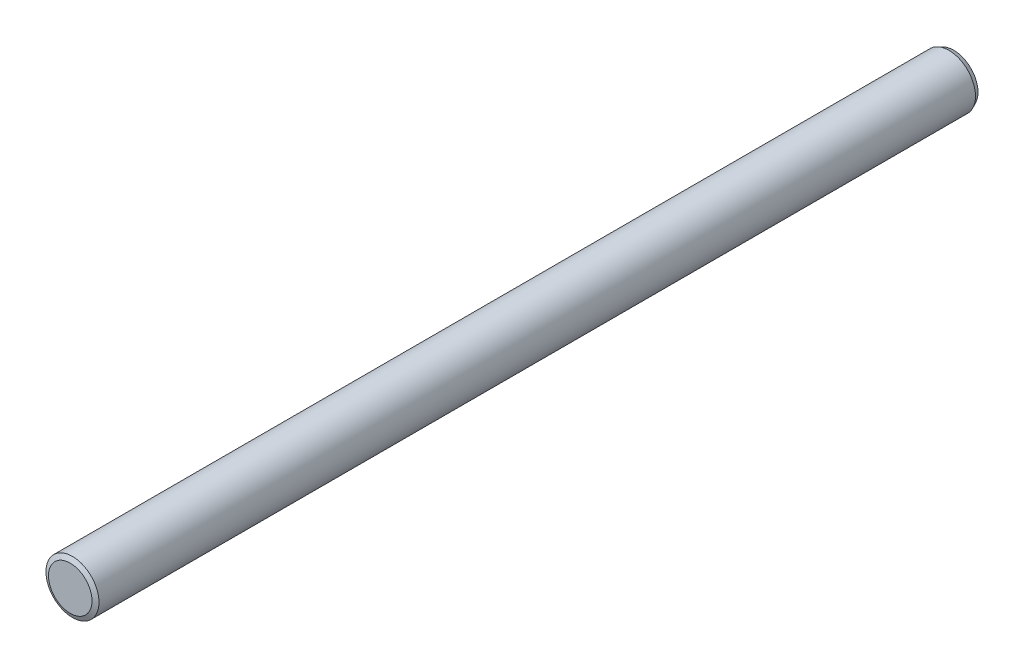
ISO-10303-21;
HEADER;
FILE_DESCRIPTION(('STEP AP214'),'2;1');
FILE_NAME('part.step','',(''),(''),'','','');
FILE_SCHEMA(('AUTOMOTIVE_DESIGN { 1 0 10303 214 1 1 1 1 }'));
ENDSEC;
DATA;
#1=APPLICATION_CONTEXT('core data for automotive mechanical design processes');
#2=APPLICATION_PROTOCOL_DEFINITION('international standard','automotive_design',2000,#1);
#3=PRODUCT_CONTEXT('',#1,'mechanical');
#4=PRODUCT('Part','Part','',(#3));
#5=PRODUCT_RELATED_PRODUCT_CATEGORY('part','',(#4));
#6=PRODUCT_DEFINITION_FORMATION('','',#4);
#7=PRODUCT_DEFINITION_CONTEXT('part definition',#1,'design');
#8=PRODUCT_DEFINITION('design','',#6,#7);
#9=PRODUCT_DEFINITION_SHAPE('','',#8);
#10=(LENGTH_UNIT() NAMED_UNIT(*) SI_UNIT(.MILLI.,.METRE.));
#11=(NAMED_UNIT(*) PLANE_ANGLE_UNIT() SI_UNIT($,.RADIAN.));
#12=(NAMED_UNIT(*) SI_UNIT($,.STERADIAN.) SOLID_ANGLE_UNIT());
#13=UNCERTAINTY_MEASURE_WITH_UNIT(LENGTH_MEASURE(1.E-05),#10,'distance_accuracy_value','');
#14=(GEOMETRIC_REPRESENTATION_CONTEXT(3) GLOBAL_UNCERTAINTY_ASSIGNED_CONTEXT((#13)) GLOBAL_UNIT_ASSIGNED_CONTEXT((#10,
#11,#12)) REPRESENTATION_CONTEXT('',''));
#15=CARTESIAN_POINT('',(0.,0.,0.));
#16=DIRECTION('',(0.,0.,1.));
#17=DIRECTION('',(1.,0.,0.));
#18=AXIS2_PLACEMENT_3D('',#15,#16,#17);
#19=CARTESIAN_POINT('',(0.,0.,50.));
#20=DIRECTION('',(0.,0.,-1.));
#21=DIRECTION('',(-1.,0.,0.));
#22=AXIS2_PLACEMENT_3D('',#19,#20,#21);
#23=CYLINDRICAL_SURFACE('',#22,3.);
#24=CARTESIAN_POINT('',(0.,0.,-49.4638732698726));
#25=DIRECTION('',(0.,0.,1.));
#26=DIRECTION('',(1.,0.,0.));
#27=AXIS2_PLACEMENT_3D('',#24,#25,#26);
#28=CIRCLE('',#27,3.);
#29=CARTESIAN_POINT('',(3.,0.,-49.4638732698726));
#30=VERTEX_POINT('',#29);
#31=EDGE_CURVE('E51',#30,#30,#28,.T.);
#32=ORIENTED_EDGE('',*,*,#31,.T.);
#33=EDGE_LOOP('',(#32));
#34=FACE_BOUND('',#33,.T.);
#35=CARTESIAN_POINT('',(0.,0.,49.75));
#36=DIRECTION('',(0.,0.,1.));
#37=DIRECTION('',(1.,0.,0.));
#38=AXIS2_PLACEMENT_3D('',#35,#36,#37);
#39=CIRCLE('',#38,3.);
#40=CARTESIAN_POINT('',(3.,0.,49.75));
#41=VERTEX_POINT('',#40);
#42=EDGE_CURVE('E54',#41,#41,#39,.F.);
#43=ORIENTED_EDGE('',*,*,#42,.T.);
#44=EDGE_LOOP('',(#43));
#45=FACE_BOUND('',#44,.T.);
#46=ADVANCED_FACE('F39',(#34,#45),#23,.T.);
#47=CARTESIAN_POINT('',(0.,0.,50.));
#48=DIRECTION('',(0.,0.,1.));
#49=DIRECTION('',(1.,0.,0.));
#50=AXIS2_PLACEMENT_3D('',#47,#48,#49);
#51=PLANE('',#50);
#52=CARTESIAN_POINT('',(0.,0.,50.));
#53=DIRECTION('',(0.,0.,1.));
#54=DIRECTION('',(1.,0.,0.));
#55=AXIS2_PLACEMENT_3D('',#52,#53,#54);
#56=CIRCLE('',#55,2.4638732698726);
#57=CARTESIAN_POINT('',(2.4638732698726,0.,50.));
#58=VERTEX_POINT('',#57);
#59=EDGE_CURVE('E10',#58,#58,#56,.T.);
#60=ORIENTED_EDGE('',*,*,#59,.T.);
#61=EDGE_LOOP('',(#60));
#62=FACE_BOUND('',#61,.T.);
#63=ADVANCED_FACE('F72',(#62),#51,.T.);
#64=CARTESIAN_POINT('',(0.,0.,-50.));
#65=DIRECTION('',(0.,0.,1.));
#66=DIRECTION('',(1.,0.,0.));
#67=AXIS2_PLACEMENT_3D('',#64,#65,#66);
#68=PLANE('',#67);
#69=CARTESIAN_POINT('',(0.,0.,-50.));
#70=DIRECTION('',(0.,0.,1.));
#71=DIRECTION('',(1.,0.,0.));
#72=AXIS2_PLACEMENT_3D('',#69,#70,#71);
#73=CIRCLE('',#72,2.75000000000001);
#74=CARTESIAN_POINT('',(2.75000000000001,0.,-50.));
#75=VERTEX_POINT('',#74);
#76=EDGE_CURVE('E50',#75,#75,#73,.F.);
#77=ORIENTED_EDGE('',*,*,#76,.T.);
#78=EDGE_LOOP('',(#77));
#79=FACE_BOUND('',#78,.T.);
#80=ADVANCED_FACE('F69',(#79),#68,.F.);
#81=CARTESIAN_POINT('',(0.,0.,-49.4638732698726));
#82=DIRECTION('',(0.,0.,1.));
#83=DIRECTION('',(1.,0.,0.));
#84=AXIS2_PLACEMENT_3D('',#81,#82,#83);
#85=CONICAL_SURFACE('',#84,3.,0.436332312998581);
#86=ORIENTED_EDGE('',*,*,#76,.F.);
#87=EDGE_LOOP('',(#86));
#88=FACE_BOUND('',#87,.T.);
#89=ORIENTED_EDGE('',*,*,#31,.F.);
#90=EDGE_LOOP('',(#89));
#91=FACE_BOUND('',#90,.T.);
#92=ADVANCED_FACE('F61',(#88,#91),#85,.T.);
#93=CARTESIAN_POINT('',(0.,0.,50.));
#94=DIRECTION('',(0.,0.,-1.));
#95=DIRECTION('',(-1.,0.,0.));
#96=AXIS2_PLACEMENT_3D('',#93,#94,#95);
#97=CONICAL_SURFACE('',#96,2.4638732698726,1.13446401379631);
#98=ORIENTED_EDGE('',*,*,#42,.F.);
#99=EDGE_LOOP('',(#98));
#100=FACE_BOUND('',#99,.T.);
#101=ORIENTED_EDGE('',*,*,#59,.F.);
#102=EDGE_LOOP('',(#101));
#103=FACE_BOUND('',#102,.T.);
#104=ADVANCED_FACE('F45',(#100,#103),#97,.T.);
#105=CLOSED_SHELL('',(#46,#63,#80,#92,#104));
#106=MANIFOLD_SOLID_BREP('B2',#105);
#107=ADVANCED_BREP_SHAPE_REPRESENTATION('',(#18,#106),#14);
#108=SHAPE_DEFINITION_REPRESENTATION(#9,#107);
ENDSEC;
END-ISO-10303-21;
